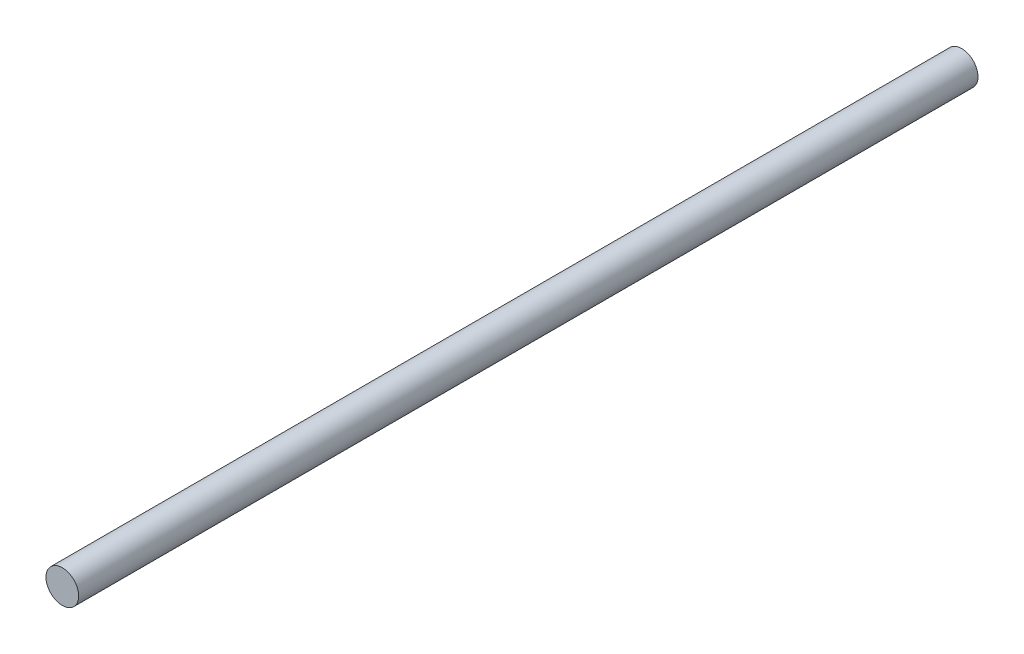
ISO-10303-21;
HEADER;
FILE_DESCRIPTION(('STEP AP214'),'2;1');
FILE_NAME('part.step','',(''),(''),'','','');
FILE_SCHEMA(('AUTOMOTIVE_DESIGN { 1 0 10303 214 1 1 1 1 }'));
ENDSEC;
DATA;
#1=APPLICATION_CONTEXT('core data for automotive mechanical design processes');
#2=APPLICATION_PROTOCOL_DEFINITION('international standard','automotive_design',2000,#1);
#3=PRODUCT_CONTEXT('',#1,'mechanical');
#4=PRODUCT('Part','Part','',(#3));
#5=PRODUCT_RELATED_PRODUCT_CATEGORY('part','',(#4));
#6=PRODUCT_DEFINITION_FORMATION('','',#4);
#7=PRODUCT_DEFINITION_CONTEXT('part definition',#1,'design');
#8=PRODUCT_DEFINITION('design','',#6,#7);
#9=PRODUCT_DEFINITION_SHAPE('','',#8);
#10=(LENGTH_UNIT() NAMED_UNIT(*) SI_UNIT(.MILLI.,.METRE.));
#11=(NAMED_UNIT(*) PLANE_ANGLE_UNIT() SI_UNIT($,.RADIAN.));
#12=(NAMED_UNIT(*) SI_UNIT($,.STERADIAN.) SOLID_ANGLE_UNIT());
#13=UNCERTAINTY_MEASURE_WITH_UNIT(LENGTH_MEASURE(1.E-05),#10,'distance_accuracy_value','');
#14=(GEOMETRIC_REPRESENTATION_CONTEXT(3) GLOBAL_UNCERTAINTY_ASSIGNED_CONTEXT((#13)) GLOBAL_UNIT_ASSIGNED_CONTEXT((#10,
#11,#12)) REPRESENTATION_CONTEXT('',''));
#15=CARTESIAN_POINT('',(0.,0.,0.));
#16=DIRECTION('',(0.,0.,1.));
#17=DIRECTION('',(1.,0.,0.));
#18=AXIS2_PLACEMENT_3D('',#15,#16,#17);
#19=CARTESIAN_POINT('',(0.,0.,220.));
#20=DIRECTION('',(0.,0.,-1.));
#21=DIRECTION('',(-1.,0.,0.));
#22=AXIS2_PLACEMENT_3D('',#19,#20,#21);
#23=CYLINDRICAL_SURFACE('',#22,4.);
#24=CARTESIAN_POINT('',(0.,0.,220.));
#25=DIRECTION('',(0.,0.,1.));
#26=DIRECTION('',(1.,0.,0.));
#27=AXIS2_PLACEMENT_3D('',#24,#25,#26);
#28=CIRCLE('',#27,4.);
#29=CARTESIAN_POINT('',(4.,0.,220.));
#30=VERTEX_POINT('',#29);
#31=EDGE_CURVE('E10',#30,#30,#28,.T.);
#32=ORIENTED_EDGE('',*,*,#31,.F.);
#33=EDGE_LOOP('',(#32));
#34=FACE_BOUND('',#33,.T.);
#35=CARTESIAN_POINT('',(0.,0.,0.));
#36=DIRECTION('',(0.,0.,1.));
#37=DIRECTION('',(1.,0.,0.));
#38=AXIS2_PLACEMENT_3D('',#35,#36,#37);
#39=CIRCLE('',#38,4.);
#40=CARTESIAN_POINT('',(4.,0.,0.));
#41=VERTEX_POINT('',#40);
#42=EDGE_CURVE('E42',#41,#41,#39,.T.);
#43=ORIENTED_EDGE('',*,*,#42,.T.);
#44=EDGE_LOOP('',(#43));
#45=FACE_BOUND('',#44,.T.);
#46=ADVANCED_FACE('F39',(#34,#45),#23,.T.);
#47=CARTESIAN_POINT('',(0.,0.,220.));
#48=DIRECTION('',(0.,0.,1.));
#49=DIRECTION('',(1.,0.,0.));
#50=AXIS2_PLACEMENT_3D('',#47,#48,#49);
#51=PLANE('',#50);
#52=ORIENTED_EDGE('',*,*,#31,.T.);
#53=EDGE_LOOP('',(#52));
#54=FACE_BOUND('',#53,.T.);
#55=ADVANCED_FACE('F54',(#54),#51,.T.);
#56=CARTESIAN_POINT('',(0.,0.,0.));
#57=DIRECTION('',(0.,0.,1.));
#58=DIRECTION('',(1.,0.,0.));
#59=AXIS2_PLACEMENT_3D('',#56,#57,#58);
#60=PLANE('',#59);
#61=ORIENTED_EDGE('',*,*,#42,.F.);
#62=EDGE_LOOP('',(#61));
#63=FACE_BOUND('',#62,.T.);
#64=ADVANCED_FACE('F52',(#63),#60,.F.);
#65=CLOSED_SHELL('',(#46,#55,#64));
#66=MANIFOLD_SOLID_BREP('B2',#65);
#67=ADVANCED_BREP_SHAPE_REPRESENTATION('',(#18,#66),#14);
#68=SHAPE_DEFINITION_REPRESENTATION(#9,#67);
ENDSEC;
END-ISO-10303-21;
